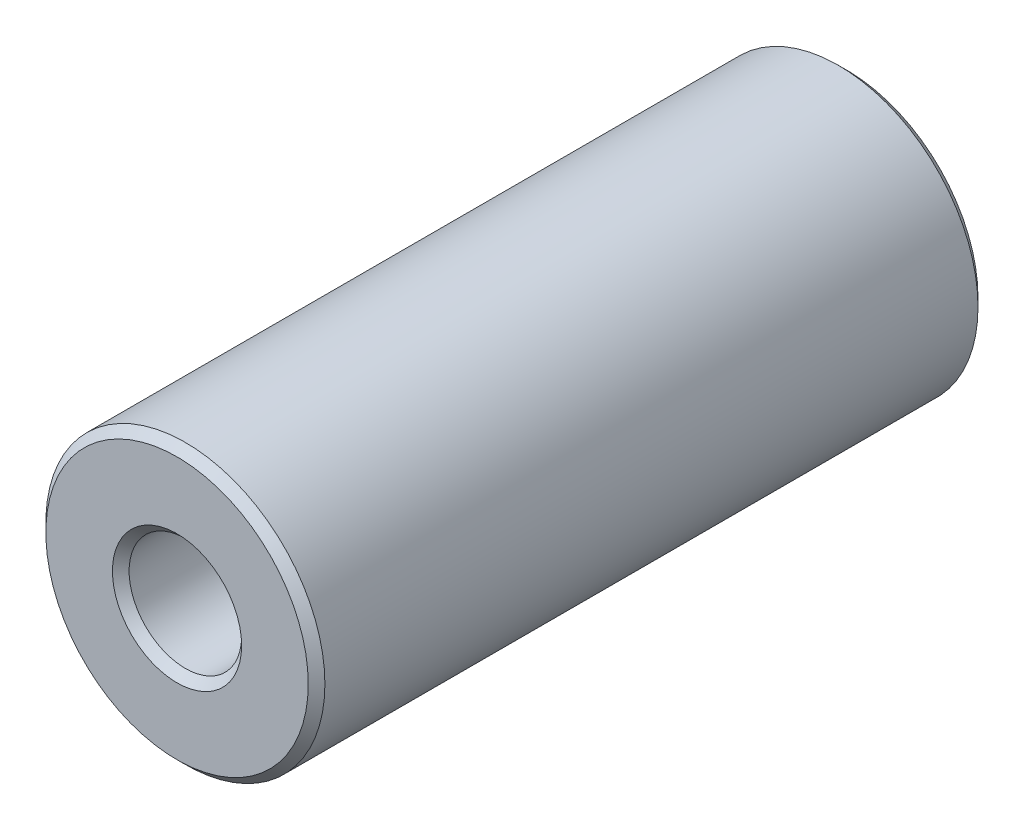
ISO-10303-21;
HEADER;
FILE_DESCRIPTION(('STEP AP214'),'2;1');
FILE_NAME('part.step','',(''),(''),'','','');
FILE_SCHEMA(('AUTOMOTIVE_DESIGN { 1 0 10303 214 1 1 1 1 }'));
ENDSEC;
DATA;
#1=APPLICATION_CONTEXT('core data for automotive mechanical design processes');
#2=APPLICATION_PROTOCOL_DEFINITION('international standard','automotive_design',2000,#1);
#3=PRODUCT_CONTEXT('',#1,'mechanical');
#4=PRODUCT('Part','Part','',(#3));
#5=PRODUCT_RELATED_PRODUCT_CATEGORY('part','',(#4));
#6=PRODUCT_DEFINITION_FORMATION('','',#4);
#7=PRODUCT_DEFINITION_CONTEXT('part definition',#1,'design');
#8=PRODUCT_DEFINITION('design','',#6,#7);
#9=PRODUCT_DEFINITION_SHAPE('','',#8);
#10=(LENGTH_UNIT() NAMED_UNIT(*) SI_UNIT(.MILLI.,.METRE.));
#11=(NAMED_UNIT(*) PLANE_ANGLE_UNIT() SI_UNIT($,.RADIAN.));
#12=(NAMED_UNIT(*) SI_UNIT($,.STERADIAN.) SOLID_ANGLE_UNIT());
#13=UNCERTAINTY_MEASURE_WITH_UNIT(LENGTH_MEASURE(1.E-05),#10,'distance_accuracy_value','');
#14=(GEOMETRIC_REPRESENTATION_CONTEXT(3) GLOBAL_UNCERTAINTY_ASSIGNED_CONTEXT((#13)) GLOBAL_UNIT_ASSIGNED_CONTEXT((#10,
#11,#12)) REPRESENTATION_CONTEXT('',''));
#15=CARTESIAN_POINT('',(0.,0.,0.));
#16=DIRECTION('',(0.,0.,1.));
#17=DIRECTION('',(1.,0.,0.));
#18=AXIS2_PLACEMENT_3D('',#15,#16,#17);
#19=CARTESIAN_POINT('',(0.,0.,-19.05));
#20=DIRECTION('',(0.,0.,1.));
#21=DIRECTION('',(1.,0.,0.));
#22=AXIS2_PLACEMENT_3D('',#19,#20,#21);
#23=CYLINDRICAL_SURFACE('',#22,7.9375);
#24=CARTESIAN_POINT('',(0.,0.,18.57629));
#25=DIRECTION('',(0.,0.,1.));
#26=DIRECTION('',(1.,0.,0.));
#27=AXIS2_PLACEMENT_3D('',#24,#25,#26);
#28=CIRCLE('',#27,7.9375);
#29=CARTESIAN_POINT('',(7.9375,0.,18.57629));
#30=VERTEX_POINT('',#29);
#31=EDGE_CURVE('E67',#30,#30,#28,.F.);
#32=CARTESIAN_POINT('',(0.,0.,-18.57629));
#33=DIRECTION('',(0.,0.,1.));
#34=DIRECTION('',(1.,0.,0.));
#35=AXIS2_PLACEMENT_3D('',#32,#33,#34);
#36=CIRCLE('',#35,7.9375);
#37=CARTESIAN_POINT('',(7.9375,0.,-18.57629));
#38=VERTEX_POINT('',#37);
#39=EDGE_CURVE('E71',#38,#38,#36,.T.);
#40=CARTESIAN_POINT('',(7.9375,0.,18.57629));
#41=CARTESIAN_POINT('',(7.9375,0.,18.1892839583333));
#42=CARTESIAN_POINT('',(7.9375,0.,17.8022779166667));
#43=CARTESIAN_POINT('',(7.9375,0.,17.0282658333333));
#44=CARTESIAN_POINT('',(7.9375,0.,16.6412597916667));
#45=CARTESIAN_POINT('',(7.9375,0.,15.8672477083333));
#46=CARTESIAN_POINT('',(7.9375,0.,15.4802416666667));
#47=CARTESIAN_POINT('',(7.9375,0.,14.7062295833333));
#48=CARTESIAN_POINT('',(7.9375,0.,14.3192235416667));
#49=CARTESIAN_POINT('',(7.9375,0.,13.5452114583333));
#50=CARTESIAN_POINT('',(7.9375,0.,13.1582054166667));
#51=CARTESIAN_POINT('',(7.9375,0.,12.3841933333333));
#52=CARTESIAN_POINT('',(7.9375,0.,11.9971872916667));
#53=CARTESIAN_POINT('',(7.9375,0.,11.2231752083333));
#54=CARTESIAN_POINT('',(7.9375,0.,10.8361691666667));
#55=CARTESIAN_POINT('',(7.9375,0.,10.0621570833333));
#56=CARTESIAN_POINT('',(7.9375,0.,9.67515104166668));
#57=CARTESIAN_POINT('',(7.9375,0.,8.90113895833334));
#58=CARTESIAN_POINT('',(7.9375,0.,8.51413291666668));
#59=CARTESIAN_POINT('',(7.9375,0.,7.74012083333334));
#60=CARTESIAN_POINT('',(7.9375,0.,7.35311479166668));
#61=CARTESIAN_POINT('',(7.9375,0.,6.57910270833334));
#62=CARTESIAN_POINT('',(7.9375,0.,6.19209666666668));
#63=CARTESIAN_POINT('',(7.9375,0.,5.41808458333334));
#64=CARTESIAN_POINT('',(7.9375,0.,5.03107854166668));
#65=CARTESIAN_POINT('',(7.9375,0.,4.25706645833334));
#66=CARTESIAN_POINT('',(7.9375,0.,3.87006041666668));
#67=CARTESIAN_POINT('',(7.9375,0.,3.09604833333334));
#68=CARTESIAN_POINT('',(7.9375,0.,2.70904229166668));
#69=CARTESIAN_POINT('',(7.9375,0.,1.93503020833335));
#70=CARTESIAN_POINT('',(7.9375,0.,1.54802416666668));
#71=CARTESIAN_POINT('',(7.9375,0.,0.774012083333347));
#72=CARTESIAN_POINT('',(7.9375,0.,0.38700604166668));
#73=CARTESIAN_POINT('',(7.9375,0.,-0.387006041666653));
#74=CARTESIAN_POINT('',(7.9375,0.,-0.774012083333319));
#75=CARTESIAN_POINT('',(7.9375,0.,-1.54802416666665));
#76=CARTESIAN_POINT('',(7.9375,0.,-1.93503020833332));
#77=CARTESIAN_POINT('',(7.9375,0.,-2.70904229166665));
#78=CARTESIAN_POINT('',(7.9375,0.,-3.09604833333332));
#79=CARTESIAN_POINT('',(7.9375,0.,-3.87006041666665));
#80=CARTESIAN_POINT('',(7.9375,0.,-4.25706645833332));
#81=CARTESIAN_POINT('',(7.9375,0.,-5.03107854166665));
#82=CARTESIAN_POINT('',(7.9375,0.,-5.41808458333331));
#83=CARTESIAN_POINT('',(7.9375,0.,-6.19209666666665));
#84=CARTESIAN_POINT('',(7.9375,0.,-6.57910270833331));
#85=CARTESIAN_POINT('',(7.9375,0.,-7.35311479166665));
#86=CARTESIAN_POINT('',(7.9375,0.,-7.74012083333331));
#87=CARTESIAN_POINT('',(7.9375,0.,-8.51413291666665));
#88=CARTESIAN_POINT('',(7.9375,0.,-8.90113895833331));
#89=CARTESIAN_POINT('',(7.9375,0.,-9.67515104166664));
#90=CARTESIAN_POINT('',(7.9375,0.,-10.0621570833333));
#91=CARTESIAN_POINT('',(7.9375,0.,-10.8361691666666));
#92=CARTESIAN_POINT('',(7.9375,0.,-11.2231752083333));
#93=CARTESIAN_POINT('',(7.9375,0.,-11.9971872916666));
#94=CARTESIAN_POINT('',(7.9375,0.,-12.3841933333333));
#95=CARTESIAN_POINT('',(7.9375,0.,-13.1582054166666));
#96=CARTESIAN_POINT('',(7.9375,0.,-13.5452114583333));
#97=CARTESIAN_POINT('',(7.9375,0.,-14.3192235416666));
#98=CARTESIAN_POINT('',(7.9375,0.,-14.7062295833333));
#99=CARTESIAN_POINT('',(7.9375,0.,-15.4802416666666));
#100=CARTESIAN_POINT('',(7.9375,0.,-15.8672477083333));
#101=CARTESIAN_POINT('',(7.9375,0.,-16.6412597916666));
#102=CARTESIAN_POINT('',(7.9375,0.,-17.0282658333333));
#103=CARTESIAN_POINT('',(7.9375,0.,-17.8022779166666));
#104=CARTESIAN_POINT('',(7.9375,0.,-18.1892839583333));
#105=CARTESIAN_POINT('',(7.9375,0.,-18.57629));
#106=B_SPLINE_CURVE_WITH_KNOTS('',3,(#40,#41,#42,#43,#44,#45,#46,#47,#48,#49,#50,#51,#52,#53,
#54,#55,#56,#57,#58,#59,#60,#61,#62,#63,#64,#65,#66,#67,#68,#69,#70,#71,#72,#73,#74,#75,#76,#77,
#78,#79,#80,#81,#82,#83,#84,#85,#86,#87,#88,#89,#90,#91,#92,#93,#94,#95,#96,#97,#98,#99,#100,
#101,#102,#103,#104,#105),.UNSPECIFIED.,.F.,.F.,(4,2,2,2,2,2,2,2,2,2,2,2,2,2,2,2,2,2,2,2,2,2,2,
2,2,2,2,2,2,2,2,2,4),(0.,1.161018125,2.32203625,3.483054375,4.6440725,5.80509062499999,
6.96610874999999,8.12712687499999,9.28814499999999,10.449163125,11.61018125,12.771199375,
13.9322175,15.093235625,16.25425375,17.415271875,18.57629,19.737308125,20.89832625,22.059344375,
23.2203625,24.381380625,25.54239875,26.703416875,27.864435,29.025453125,30.18647125,
31.347489375,32.5085075,33.669525625,34.83054375,35.991561875,37.15258),.UNSPECIFIED.);
#107=EDGE_CURVE('BSEAM41',#30,#38,#106,.T.);
#108=ORIENTED_EDGE('',*,*,#31,.T.);
#109=ORIENTED_EDGE('',*,*,#39,.T.);
#110=ORIENTED_EDGE('',*,*,#107,.T.);
#111=ORIENTED_EDGE('',*,*,#107,.F.);
#112=EDGE_LOOP('',(#108,#110,#109,#111));
#113=FACE_BOUND('',#112,.T.);
#114=ADVANCED_FACE('F41',(#113),#23,.T.);
#115=CARTESIAN_POINT('',(0.,0.,-19.05));
#116=DIRECTION('',(0.,0.,1.));
#117=DIRECTION('',(1.,0.,0.));
#118=AXIS2_PLACEMENT_3D('',#115,#116,#117);
#119=PLANE('',#118);
#120=CARTESIAN_POINT('',(0.,0.,-19.05));
#121=DIRECTION('',(0.,0.,1.));
#122=DIRECTION('',(1.,0.,0.));
#123=AXIS2_PLACEMENT_3D('',#120,#121,#122);
#124=CIRCLE('',#123,7.46378999999998);
#125=CARTESIAN_POINT('',(7.46378999999997,0.,-19.05));
#126=VERTEX_POINT('',#125);
#127=EDGE_CURVE('E55',#126,#126,#124,.F.);
#128=ORIENTED_EDGE('',*,*,#127,.T.);
#129=EDGE_LOOP('',(#128));
#130=FACE_BOUND('',#129,.T.);
#131=CARTESIAN_POINT('',(0.,0.,-19.05));
#132=DIRECTION('',(0.,0.,1.));
#133=DIRECTION('',(1.,0.,0.));
#134=AXIS2_PLACEMENT_3D('',#131,#132,#133);
#135=CIRCLE('',#134,3.67410999999998);
#136=CARTESIAN_POINT('',(3.67410999999998,0.,-19.05));
#137=VERTEX_POINT('',#136);
#138=EDGE_CURVE('E61',#137,#137,#135,.T.);
#139=ORIENTED_EDGE('',*,*,#138,.T.);
#140=EDGE_LOOP('',(#139));
#141=FACE_BOUND('',#140,.T.);
#142=ADVANCED_FACE('F100',(#130,#141),#119,.F.);
#143=CARTESIAN_POINT('',(0.,0.,-19.05));
#144=DIRECTION('',(0.,0.,1.));
#145=DIRECTION('',(1.,0.,0.));
#146=AXIS2_PLACEMENT_3D('',#143,#144,#145);
#147=CYLINDRICAL_SURFACE('',#146,3.2004);
#148=CARTESIAN_POINT('',(0.,0.,18.57629));
#149=DIRECTION('',(0.,0.,1.));
#150=DIRECTION('',(1.,0.,0.));
#151=AXIS2_PLACEMENT_3D('',#148,#149,#150);
#152=CIRCLE('',#151,3.2004);
#153=CARTESIAN_POINT('',(3.2004,0.,18.5762899999999));
#154=VERTEX_POINT('',#153);
#155=EDGE_CURVE('E10',#154,#154,#152,.T.);
#156=CARTESIAN_POINT('',(0.,0.,-18.57629));
#157=DIRECTION('',(0.,0.,1.));
#158=DIRECTION('',(1.,0.,0.));
#159=AXIS2_PLACEMENT_3D('',#156,#157,#158);
#160=CIRCLE('',#159,3.2004);
#161=CARTESIAN_POINT('',(3.2004,0.,-18.57629));
#162=VERTEX_POINT('',#161);
#163=EDGE_CURVE('E49',#162,#162,#160,.F.);
#164=CARTESIAN_POINT('',(3.2004,0.,18.5762899999999));
#165=CARTESIAN_POINT('',(3.2004,0.,18.1892839583333));
#166=CARTESIAN_POINT('',(3.2004,0.,17.8022779166666));
#167=CARTESIAN_POINT('',(3.2004,0.,17.0282658333333));
#168=CARTESIAN_POINT('',(3.2004,0.,16.6412597916666));
#169=CARTESIAN_POINT('',(3.2004,0.,15.8672477083333));
#170=CARTESIAN_POINT('',(3.2004,0.,15.4802416666666));
#171=CARTESIAN_POINT('',(3.2004,0.,14.7062295833333));
#172=CARTESIAN_POINT('',(3.2004,0.,14.3192235416666));
#173=CARTESIAN_POINT('',(3.2004,0.,13.5452114583333));
#174=CARTESIAN_POINT('',(3.2004,0.,13.1582054166666));
#175=CARTESIAN_POINT('',(3.2004,0.,12.3841933333333));
#176=CARTESIAN_POINT('',(3.2004,0.,11.9971872916666));
#177=CARTESIAN_POINT('',(3.2004,0.,11.2231752083333));
#178=CARTESIAN_POINT('',(3.2004,0.,10.8361691666666));
#179=CARTESIAN_POINT('',(3.2004,0.,10.0621570833333));
#180=CARTESIAN_POINT('',(3.2004,0.,9.67515104166662));
#181=CARTESIAN_POINT('',(3.2004,0.,8.90113895833329));
#182=CARTESIAN_POINT('',(3.2004,0.,8.51413291666662));
#183=CARTESIAN_POINT('',(3.2004,0.,7.74012083333329));
#184=CARTESIAN_POINT('',(3.2004,0.,7.35311479166662));
#185=CARTESIAN_POINT('',(3.2004,0.,6.57910270833329));
#186=CARTESIAN_POINT('',(3.2004,0.,6.19209666666662));
#187=CARTESIAN_POINT('',(3.2004,0.,5.41808458333329));
#188=CARTESIAN_POINT('',(3.2004,0.,5.03107854166662));
#189=CARTESIAN_POINT('',(3.2004,0.,4.25706645833329));
#190=CARTESIAN_POINT('',(3.2004,0.,3.87006041666662));
#191=CARTESIAN_POINT('',(3.2004,0.,3.09604833333329));
#192=CARTESIAN_POINT('',(3.2004,0.,2.70904229166662));
#193=CARTESIAN_POINT('',(3.2004,0.,1.93503020833329));
#194=CARTESIAN_POINT('',(3.2004,0.,1.54802416666662));
#195=CARTESIAN_POINT('',(3.2004,0.,0.774012083333292));
#196=CARTESIAN_POINT('',(3.2004,0.,0.387006041666625));
#197=CARTESIAN_POINT('',(3.2004,0.,-0.387006041666708));
#198=CARTESIAN_POINT('',(3.2004,0.,-0.774012083333375));
#199=CARTESIAN_POINT('',(3.2004,0.,-1.54802416666671));
#200=CARTESIAN_POINT('',(3.2004,0.,-1.93503020833337));
#201=CARTESIAN_POINT('',(3.2004,0.,-2.70904229166671));
#202=CARTESIAN_POINT('',(3.2004,0.,-3.09604833333337));
#203=CARTESIAN_POINT('',(3.2004,0.,-3.87006041666671));
#204=CARTESIAN_POINT('',(3.2004,0.,-4.25706645833337));
#205=CARTESIAN_POINT('',(3.2004,0.,-5.0310785416667));
#206=CARTESIAN_POINT('',(3.2004,0.,-5.41808458333337));
#207=CARTESIAN_POINT('',(3.2004,0.,-6.1920966666667));
#208=CARTESIAN_POINT('',(3.2004,0.,-6.57910270833337));
#209=CARTESIAN_POINT('',(3.2004,0.,-7.3531147916667));
#210=CARTESIAN_POINT('',(3.2004,0.,-7.74012083333337));
#211=CARTESIAN_POINT('',(3.2004,0.,-8.5141329166667));
#212=CARTESIAN_POINT('',(3.2004,0.,-8.90113895833337));
#213=CARTESIAN_POINT('',(3.2004,0.,-9.6751510416667));
#214=CARTESIAN_POINT('',(3.2004,0.,-10.0621570833334));
#215=CARTESIAN_POINT('',(3.2004,0.,-10.8361691666667));
#216=CARTESIAN_POINT('',(3.2004,0.,-11.2231752083334));
#217=CARTESIAN_POINT('',(3.2004,0.,-11.9971872916667));
#218=CARTESIAN_POINT('',(3.2004,0.,-12.3841933333334));
#219=CARTESIAN_POINT('',(3.2004,0.,-13.1582054166667));
#220=CARTESIAN_POINT('',(3.2004,0.,-13.5452114583334));
#221=CARTESIAN_POINT('',(3.2004,0.,-14.3192235416667));
#222=CARTESIAN_POINT('',(3.2004,0.,-14.7062295833334));
#223=CARTESIAN_POINT('',(3.2004,0.,-15.4802416666667));
#224=CARTESIAN_POINT('',(3.2004,0.,-15.8672477083334));
#225=CARTESIAN_POINT('',(3.2004,0.,-16.6412597916667));
#226=CARTESIAN_POINT('',(3.2004,0.,-17.0282658333334));
#227=CARTESIAN_POINT('',(3.2004,0.,-17.8022779166667));
#228=CARTESIAN_POINT('',(3.2004,0.,-18.1892839583334));
#229=CARTESIAN_POINT('',(3.2004,0.,-18.57629));
#230=B_SPLINE_CURVE_WITH_KNOTS('',3,(#164,#165,#166,#167,#168,#169,#170,#171,#172,#173,#174,
#175,#176,#177,#178,#179,#180,#181,#182,#183,#184,#185,#186,#187,#188,#189,#190,#191,#192,#193,
#194,#195,#196,#197,#198,#199,#200,#201,#202,#203,#204,#205,#206,#207,#208,#209,#210,#211,#212,
#213,#214,#215,#216,#217,#218,#219,#220,#221,#222,#223,#224,#225,#226,#227,#228,#229),
.UNSPECIFIED.,.F.,.F.,(4,2,2,2,2,2,2,2,2,2,2,2,2,2,2,2,2,2,2,2,2,2,2,2,2,2,2,2,2,2,2,2,4),(0.,
1.161018125,2.32203625,3.483054375,4.6440725,5.80509062499999,6.96610874999999,8.12712687499999,
9.28814499999999,10.449163125,11.61018125,12.771199375,13.9322175,15.093235625,16.25425375,
17.415271875,18.57629,19.737308125,20.89832625,22.059344375,23.2203625,24.381380625,25.54239875,
26.703416875,27.864435,29.025453125,30.18647125,31.347489375,32.5085075,33.669525625,
34.83054375,35.991561875,37.15258),.UNSPECIFIED.);
#231=EDGE_CURVE('BSEAM106',#154,#162,#230,.T.);
#232=ORIENTED_EDGE('',*,*,#155,.T.);
#233=ORIENTED_EDGE('',*,*,#163,.T.);
#234=ORIENTED_EDGE('',*,*,#231,.T.);
#235=ORIENTED_EDGE('',*,*,#231,.F.);
#236=EDGE_LOOP('',(#232,#234,#233,#235));
#237=FACE_BOUND('',#236,.T.);
#238=ADVANCED_FACE('F106',(#237),#147,.F.);
#239=CARTESIAN_POINT('',(0.,0.,19.05));
#240=DIRECTION('',(0.,0.,1.));
#241=DIRECTION('',(1.,0.,0.));
#242=AXIS2_PLACEMENT_3D('',#239,#240,#241);
#243=PLANE('',#242);
#244=CARTESIAN_POINT('',(0.,0.,19.05));
#245=DIRECTION('',(0.,0.,1.));
#246=DIRECTION('',(1.,0.,0.));
#247=AXIS2_PLACEMENT_3D('',#244,#245,#246);
#248=CIRCLE('',#247,7.46379);
#249=CARTESIAN_POINT('',(7.46379,0.,19.05));
#250=VERTEX_POINT('',#249);
#251=EDGE_CURVE('E75',#250,#250,#248,.T.);
#252=ORIENTED_EDGE('',*,*,#251,.T.);
#253=EDGE_LOOP('',(#252));
#254=FACE_BOUND('',#253,.T.);
#255=CARTESIAN_POINT('',(0.,0.,19.05));
#256=DIRECTION('',(0.,0.,1.));
#257=DIRECTION('',(1.,0.,0.));
#258=AXIS2_PLACEMENT_3D('',#255,#256,#257);
#259=CIRCLE('',#258,3.67411000000004);
#260=CARTESIAN_POINT('',(3.67411000000003,0.,19.05));
#261=VERTEX_POINT('',#260);
#262=EDGE_CURVE('E79',#261,#261,#259,.F.);
#263=ORIENTED_EDGE('',*,*,#262,.T.);
#264=EDGE_LOOP('',(#263));
#265=FACE_BOUND('',#264,.T.);
#266=ADVANCED_FACE('F85',(#254,#265),#243,.T.);
#267=CARTESIAN_POINT('',(0.,0.,19.05));
#268=DIRECTION('',(0.,0.,-1.));
#269=DIRECTION('',(-1.,0.,0.));
#270=AXIS2_PLACEMENT_3D('',#267,#268,#269);
#271=CONICAL_SURFACE('',#270,7.46379,0.785398163397456);
#272=ORIENTED_EDGE('',*,*,#31,.F.);
#273=EDGE_LOOP('',(#272));
#274=FACE_BOUND('',#273,.T.);
#275=ORIENTED_EDGE('',*,*,#251,.F.);
#276=EDGE_LOOP('',(#275));
#277=FACE_BOUND('',#276,.T.);
#278=ADVANCED_FACE('F96',(#274,#277),#271,.T.);
#279=CARTESIAN_POINT('',(0.,0.,-18.57629));
#280=DIRECTION('',(0.,0.,1.));
#281=DIRECTION('',(1.,0.,0.));
#282=AXIS2_PLACEMENT_3D('',#279,#280,#281);
#283=CONICAL_SURFACE('',#282,7.9375,0.785398163397443);
#284=CARTESIAN_POINT('',(7.46378999999997,0.,-19.05));
#285=CARTESIAN_POINT('',(7.46872447916664,0.,-19.0450655208333));
#286=CARTESIAN_POINT('',(7.47365895833331,0.,-19.0401310416667));
#287=CARTESIAN_POINT('',(7.48352791666664,0.,-19.0302620833333));
#288=CARTESIAN_POINT('',(7.48846239583331,0.,-19.0253276041667));
#289=CARTESIAN_POINT('',(7.49833135416664,0.,-19.0154586458333));
#290=CARTESIAN_POINT('',(7.50326583333331,0.,-19.0105241666667));
#291=CARTESIAN_POINT('',(7.51313479166664,0.,-19.0006552083333));
#292=CARTESIAN_POINT('',(7.51806927083331,0.,-18.9957207291667));
#293=CARTESIAN_POINT('',(7.52793822916664,0.,-18.9858517708333));
#294=CARTESIAN_POINT('',(7.53287270833331,0.,-18.9809172916667));
#295=CARTESIAN_POINT('',(7.54274166666664,0.,-18.9710483333333));
#296=CARTESIAN_POINT('',(7.54767614583331,0.,-18.9661138541667));
#297=CARTESIAN_POINT('',(7.55754510416665,0.,-18.9562448958333));
#298=CARTESIAN_POINT('',(7.56247958333331,0.,-18.9513104166667));
#299=CARTESIAN_POINT('',(7.57234854166664,0.,-18.9414414583333));
#300=CARTESIAN_POINT('',(7.57728302083331,0.,-18.9365069791667));
#301=CARTESIAN_POINT('',(7.58715197916665,0.,-18.9266380208333));
#302=CARTESIAN_POINT('',(7.59208645833331,0.,-18.9217035416667));
#303=CARTESIAN_POINT('',(7.60195541666665,0.,-18.9118345833333));
#304=CARTESIAN_POINT('',(7.60688989583331,0.,-18.9069001041667));
#305=CARTESIAN_POINT('',(7.61675885416665,0.,-18.8970311458333));
#306=CARTESIAN_POINT('',(7.62169333333331,0.,-18.8920966666667));
#307=CARTESIAN_POINT('',(7.63156229166665,0.,-18.8822277083333));
#308=CARTESIAN_POINT('',(7.63649677083332,0.,-18.8772932291667));
#309=CARTESIAN_POINT('',(7.64636572916665,0.,-18.8674242708333));
#310=CARTESIAN_POINT('',(7.65130020833332,0.,-18.8624897916667));
#311=CARTESIAN_POINT('',(7.66116916666665,0.,-18.8526208333333));
#312=CARTESIAN_POINT('',(7.66610364583332,0.,-18.8476863541667));
#313=CARTESIAN_POINT('',(7.67597260416665,0.,-18.8378173958333));
#314=CARTESIAN_POINT('',(7.68090708333332,0.,-18.8328829166667));
#315=CARTESIAN_POINT('',(7.69077604166665,0.,-18.8230139583333));
#316=CARTESIAN_POINT('',(7.69571052083332,0.,-18.8180794791667));
#317=CARTESIAN_POINT('',(7.70557947916665,0.,-18.8082105208333));
#318=CARTESIAN_POINT('',(7.71051395833332,0.,-18.8032760416667));
#319=CARTESIAN_POINT('',(7.72038291666665,0.,-18.7934070833333));
#320=CARTESIAN_POINT('',(7.72531739583332,0.,-18.7884726041666));
#321=CARTESIAN_POINT('',(7.73518635416665,0.,-18.7786036458333));
#322=CARTESIAN_POINT('',(7.74012083333332,0.,-18.7736691666667));
#323=CARTESIAN_POINT('',(7.74998979166666,0.,-18.7638002083333));
#324=CARTESIAN_POINT('',(7.75492427083332,0.,-18.7588657291667));
#325=CARTESIAN_POINT('',(7.76479322916666,0.,-18.7489967708333));
#326=CARTESIAN_POINT('',(7.76972770833332,0.,-18.7440622916666));
#327=CARTESIAN_POINT('',(7.77959666666666,0.,-18.7341933333333));
#328=CARTESIAN_POINT('',(7.78453114583332,0.,-18.7292588541666));
#329=CARTESIAN_POINT('',(7.79440010416666,0.,-18.7193898958333));
#330=CARTESIAN_POINT('',(7.79933458333332,0.,-18.7144554166666));
#331=CARTESIAN_POINT('',(7.80920354166666,0.,-18.7045864583333));
#332=CARTESIAN_POINT('',(7.81413802083332,0.,-18.6996519791666));
#333=CARTESIAN_POINT('',(7.82400697916666,0.,-18.6897830208333));
#334=CARTESIAN_POINT('',(7.82894145833333,0.,-18.6848485416666));
#335=CARTESIAN_POINT('',(7.83881041666666,0.,-18.6749795833333));
#336=CARTESIAN_POINT('',(7.84374489583333,0.,-18.6700451041666));
#337=CARTESIAN_POINT('',(7.85361385416666,0.,-18.6601761458333));
#338=CARTESIAN_POINT('',(7.85854833333333,0.,-18.6552416666666));
#339=CARTESIAN_POINT('',(7.86841729166666,0.,-18.6453727083333));
#340=CARTESIAN_POINT('',(7.87335177083333,0.,-18.6404382291666));
#341=CARTESIAN_POINT('',(7.88322072916666,0.,-18.6305692708333));
#342=CARTESIAN_POINT('',(7.88815520833333,0.,-18.6256347916666));
#343=CARTESIAN_POINT('',(7.89802416666666,0.,-18.6157658333333));
#344=CARTESIAN_POINT('',(7.90295864583333,0.,-18.6108313541666));
#345=CARTESIAN_POINT('',(7.91282760416667,0.,-18.6009623958333));
#346=CARTESIAN_POINT('',(7.91776208333333,0.,-18.5960279166666));
#347=CARTESIAN_POINT('',(7.92763104166666,0.,-18.5861589583333));
#348=CARTESIAN_POINT('',(7.93256552083333,0.,-18.5812244791666));
#349=CARTESIAN_POINT('',(7.9375,0.,-18.57629));
#350=B_SPLINE_CURVE_WITH_KNOTS('',3,(#284,#285,#286,#287,#288,#289,#290,#291,#292,#293,#294,
#295,#296,#297,#298,#299,#300,#301,#302,#303,#304,#305,#306,#307,#308,#309,#310,#311,#312,#313,
#314,#315,#316,#317,#318,#319,#320,#321,#322,#323,#324,#325,#326,#327,#328,#329,#330,#331,#332,
#333,#334,#335,#336,#337,#338,#339,#340,#341,#342,#343,#344,#345,#346,#347,#348,#349),
.UNSPECIFIED.,.F.,.F.,(4,2,2,2,2,2,2,2,2,2,2,2,2,2,2,2,2,2,2,2,2,2,2,2,2,2,2,2,2,2,2,2,4),(0.,
0.0209352220822419,0.041870444164487,0.0628056662467289,0.0837408883289733,0.104676110411218,
0.12561133249346,0.146546554575705,0.167481776657949,0.188416998740192,0.209352220822436,
0.230287442904678,0.251222664986923,0.272157887069167,0.293093109151409,0.314028331233654,
0.334963553315899,0.355898775398141,0.376833997480386,0.397769219562628,0.418704441644872,
0.439639663727117,0.460574885809359,0.481510107891603,0.502445329973848,0.52338055205609,
0.544315774138335,0.565250996220577,0.586186218302821,0.607121440385067,0.628056662467309,
0.648991884549553,0.669927106631798),.UNSPECIFIED.);
#351=EDGE_CURVE('BSEAM90',#126,#38,#350,.T.);
#352=ORIENTED_EDGE('',*,*,#127,.F.);
#353=ORIENTED_EDGE('',*,*,#39,.F.);
#354=ORIENTED_EDGE('',*,*,#351,.T.);
#355=ORIENTED_EDGE('',*,*,#351,.F.);
#356=EDGE_LOOP('',(#352,#354,#353,#355));
#357=FACE_BOUND('',#356,.T.);
#358=ADVANCED_FACE('F90',(#357),#283,.T.);
#359=CARTESIAN_POINT('',(0.,0.,18.57629));
#360=DIRECTION('',(0.,0.,1.));
#361=DIRECTION('',(1.,0.,0.));
#362=AXIS2_PLACEMENT_3D('',#359,#360,#361);
#363=CONICAL_SURFACE('',#362,3.2004,0.78539816339744);
#364=CARTESIAN_POINT('',(3.67411000000003,0.,19.05));
#365=CARTESIAN_POINT('',(3.66917552083337,0.,19.0450655208333));
#366=CARTESIAN_POINT('',(3.6642410416667,0.,19.0401310416667));
#367=CARTESIAN_POINT('',(3.65437208333337,0.,19.0302620833333));
#368=CARTESIAN_POINT('',(3.6494376041667,0.,19.0253276041667));
#369=CARTESIAN_POINT('',(3.63956864583336,0.,19.0154586458333));
#370=CARTESIAN_POINT('',(3.6346341666667,0.,19.0105241666667));
#371=CARTESIAN_POINT('',(3.62476520833336,0.,19.0006552083333));
#372=CARTESIAN_POINT('',(3.6198307291667,0.,18.9957207291667));
#373=CARTESIAN_POINT('',(3.60996177083336,0.,18.9858517708333));
#374=CARTESIAN_POINT('',(3.60502729166669,0.,18.9809172916667));
#375=CARTESIAN_POINT('',(3.59515833333336,0.,18.9710483333333));
#376=CARTESIAN_POINT('',(3.59022385416669,0.,18.9661138541667));
#377=CARTESIAN_POINT('',(3.58035489583336,0.,18.9562448958333));
#378=CARTESIAN_POINT('',(3.57542041666669,0.,18.9513104166667));
#379=CARTESIAN_POINT('',(3.56555145833336,0.,18.9414414583333));
#380=CARTESIAN_POINT('',(3.56061697916669,0.,18.9365069791667));
#381=CARTESIAN_POINT('',(3.55074802083336,0.,18.9266380208333));
#382=CARTESIAN_POINT('',(3.54581354166669,0.,18.9217035416667));
#383=CARTESIAN_POINT('',(3.53594458333335,0.,18.9118345833333));
#384=CARTESIAN_POINT('',(3.53101010416669,0.,18.9069001041666));
#385=CARTESIAN_POINT('',(3.52114114583335,0.,18.8970311458333));
#386=CARTESIAN_POINT('',(3.51620666666669,0.,18.8920966666666));
#387=CARTESIAN_POINT('',(3.50633770833335,0.,18.8822277083333));
#388=CARTESIAN_POINT('',(3.50140322916669,0.,18.8772932291666));
#389=CARTESIAN_POINT('',(3.49153427083335,0.,18.8674242708333));
#390=CARTESIAN_POINT('',(3.48659979166668,0.,18.8624897916666));
#391=CARTESIAN_POINT('',(3.47673083333335,0.,18.8526208333333));
#392=CARTESIAN_POINT('',(3.47179635416668,0.,18.8476863541666));
#393=CARTESIAN_POINT('',(3.46192739583335,0.,18.8378173958333));
#394=CARTESIAN_POINT('',(3.45699291666668,0.,18.8328829166666));
#395=CARTESIAN_POINT('',(3.44712395833335,0.,18.8230139583333));
#396=CARTESIAN_POINT('',(3.44218947916668,0.,18.8180794791666));
#397=CARTESIAN_POINT('',(3.43232052083335,0.,18.8082105208333));
#398=CARTESIAN_POINT('',(3.42738604166668,0.,18.8032760416666));
#399=CARTESIAN_POINT('',(3.41751708333334,0.,18.7934070833333));
#400=CARTESIAN_POINT('',(3.41258260416668,0.,18.7884726041666));
#401=CARTESIAN_POINT('',(3.40271364583334,0.,18.7786036458333));
#402=CARTESIAN_POINT('',(3.39777916666668,0.,18.7736691666666));
#403=CARTESIAN_POINT('',(3.38791020833334,0.,18.7638002083333));
#404=CARTESIAN_POINT('',(3.38297572916667,0.,18.7588657291666));
#405=CARTESIAN_POINT('',(3.37310677083334,0.,18.7489967708333));
#406=CARTESIAN_POINT('',(3.36817229166667,0.,18.7440622916666));
#407=CARTESIAN_POINT('',(3.35830333333334,0.,18.7341933333333));
#408=CARTESIAN_POINT('',(3.35336885416667,0.,18.7292588541666));
#409=CARTESIAN_POINT('',(3.34349989583334,0.,18.7193898958333));
#410=CARTESIAN_POINT('',(3.33856541666667,0.,18.7144554166666));
#411=CARTESIAN_POINT('',(3.32869645833334,0.,18.7045864583333));
#412=CARTESIAN_POINT('',(3.32376197916667,0.,18.6996519791666));
#413=CARTESIAN_POINT('',(3.31389302083333,0.,18.6897830208333));
#414=CARTESIAN_POINT('',(3.30895854166667,0.,18.6848485416666));
#415=CARTESIAN_POINT('',(3.29908958333333,0.,18.6749795833333));
#416=CARTESIAN_POINT('',(3.29415510416667,0.,18.6700451041666));
#417=CARTESIAN_POINT('',(3.28428614583333,0.,18.6601761458333));
#418=CARTESIAN_POINT('',(3.27935166666666,0.,18.6552416666666));
#419=CARTESIAN_POINT('',(3.26948270833333,0.,18.6453727083333));
#420=CARTESIAN_POINT('',(3.26454822916666,0.,18.6404382291666));
#421=CARTESIAN_POINT('',(3.25467927083333,0.,18.6305692708333));
#422=CARTESIAN_POINT('',(3.24974479166666,0.,18.6256347916666));
#423=CARTESIAN_POINT('',(3.23987583333333,0.,18.6157658333333));
#424=CARTESIAN_POINT('',(3.23494135416666,0.,18.6108313541666));
#425=CARTESIAN_POINT('',(3.22507239583333,0.,18.6009623958333));
#426=CARTESIAN_POINT('',(3.22013791666666,0.,18.5960279166666));
#427=CARTESIAN_POINT('',(3.21026895833333,0.,18.5861589583333));
#428=CARTESIAN_POINT('',(3.20533447916666,0.,18.5812244791666));
#429=CARTESIAN_POINT('',(3.20039999999999,0.,18.57629));
#430=B_SPLINE_CURVE_WITH_KNOTS('',3,(#364,#365,#366,#367,#368,#369,#370,#371,#372,#373,#374,
#375,#376,#377,#378,#379,#380,#381,#382,#383,#384,#385,#386,#387,#388,#389,#390,#391,#392,#393,
#394,#395,#396,#397,#398,#399,#400,#401,#402,#403,#404,#405,#406,#407,#408,#409,#410,#411,#412,
#413,#414,#415,#416,#417,#418,#419,#420,#421,#422,#423,#424,#425,#426,#427,#428,#429),
.UNSPECIFIED.,.F.,.F.,(4,2,2,2,2,2,2,2,2,2,2,2,2,2,2,2,2,2,2,2,2,2,2,2,2,2,2,2,2,2,2,2,4),(0.,
0.020935222082245,0.04187044416449,0.0628056662467347,0.0837408883289797,0.104676110411225,
0.125611332493467,0.146546554575712,0.167481776657957,0.188416998740202,0.209352220822447,
0.23028744290469,0.251222664986935,0.27215788706918,0.293093109151425,0.31402833123367,
0.334963553315912,0.355898775398157,0.376833997480402,0.397769219562647,0.418704441644893,
0.439639663727138,0.46057488580938,0.481510107891625,0.50244532997387,0.523380552056115,
0.54431577413836,0.565250996220602,0.586186218302847,0.607121440385092,0.628056662467337,
0.648991884549582,0.669927106631825),.UNSPECIFIED.);
#431=EDGE_CURVE('BSEAM87',#261,#154,#430,.T.);
#432=ORIENTED_EDGE('',*,*,#262,.F.);
#433=ORIENTED_EDGE('',*,*,#155,.F.);
#434=ORIENTED_EDGE('',*,*,#431,.T.);
#435=ORIENTED_EDGE('',*,*,#431,.F.);
#436=EDGE_LOOP('',(#432,#434,#433,#435));
#437=FACE_BOUND('',#436,.T.);
#438=ADVANCED_FACE('F87',(#437),#363,.F.);
#439=CARTESIAN_POINT('',(0.,0.,-19.05));
#440=DIRECTION('',(0.,0.,-1.));
#441=DIRECTION('',(-1.,0.,0.));
#442=AXIS2_PLACEMENT_3D('',#439,#440,#441);
#443=CONICAL_SURFACE('',#442,3.67410999999998,0.785398163397447);
#444=ORIENTED_EDGE('',*,*,#163,.F.);
#445=EDGE_LOOP('',(#444));
#446=FACE_BOUND('',#445,.T.);
#447=ORIENTED_EDGE('',*,*,#138,.F.);
#448=EDGE_LOOP('',(#447));
#449=FACE_BOUND('',#448,.T.);
#450=ADVANCED_FACE('F43',(#446,#449),#443,.F.);
#451=CLOSED_SHELL('',(#114,#142,#238,#266,#278,#358,#438,#450));
#452=MANIFOLD_SOLID_BREP('B2',#451);
#453=ADVANCED_BREP_SHAPE_REPRESENTATION('',(#18,#452),#14);
#454=SHAPE_DEFINITION_REPRESENTATION(#9,#453);
ENDSEC;
END-ISO-10303-21;
